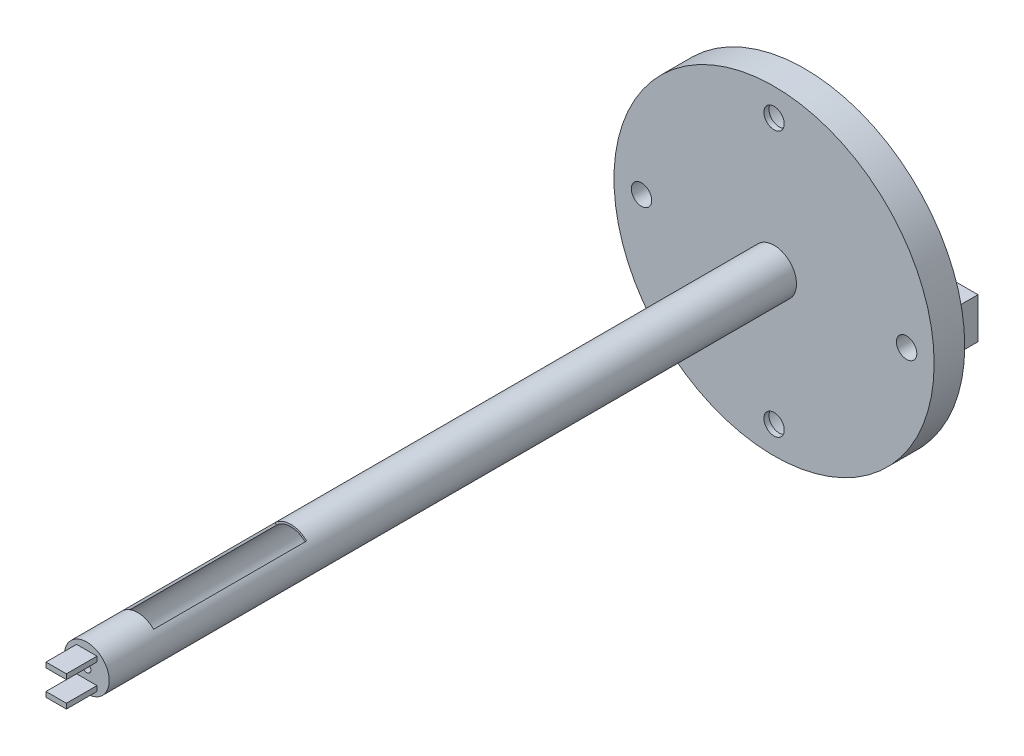
ISO-10303-21;
HEADER;
FILE_DESCRIPTION(('STEP AP214'),'2;1');
FILE_NAME('part.step','',(''),(''),'','','');
FILE_SCHEMA(('AUTOMOTIVE_DESIGN { 1 0 10303 214 1 1 1 1 }'));
ENDSEC;
DATA;
#1=APPLICATION_CONTEXT('core data for automotive mechanical design processes');
#2=APPLICATION_PROTOCOL_DEFINITION('international standard','automotive_design',2000,#1);
#3=PRODUCT_CONTEXT('',#1,'mechanical');
#4=PRODUCT('Part','Part','',(#3));
#5=PRODUCT_RELATED_PRODUCT_CATEGORY('part','',(#4));
#6=PRODUCT_DEFINITION_FORMATION('','',#4);
#7=PRODUCT_DEFINITION_CONTEXT('part definition',#1,'design');
#8=PRODUCT_DEFINITION('design','',#6,#7);
#9=PRODUCT_DEFINITION_SHAPE('','',#8);
#10=(LENGTH_UNIT() NAMED_UNIT(*) SI_UNIT(.MILLI.,.METRE.));
#11=(NAMED_UNIT(*) PLANE_ANGLE_UNIT() SI_UNIT($,.RADIAN.));
#12=(NAMED_UNIT(*) SI_UNIT($,.STERADIAN.) SOLID_ANGLE_UNIT());
#13=UNCERTAINTY_MEASURE_WITH_UNIT(LENGTH_MEASURE(1.E-05),#10,'distance_accuracy_value','');
#14=(GEOMETRIC_REPRESENTATION_CONTEXT(3) GLOBAL_UNCERTAINTY_ASSIGNED_CONTEXT((#13)) GLOBAL_UNIT_ASSIGNED_CONTEXT((#10,
#11,#12)) REPRESENTATION_CONTEXT('',''));
#15=CARTESIAN_POINT('',(0.,0.,0.));
#16=DIRECTION('',(0.,0.,1.));
#17=DIRECTION('',(1.,0.,0.));
#18=AXIS2_PLACEMENT_3D('',#15,#16,#17);
#19=CARTESIAN_POINT('',(-2.,2.,-3.));
#20=DIRECTION('',(0.,-1.,0.));
#21=DIRECTION('',(0.,0.,-1.));
#22=AXIS2_PLACEMENT_3D('',#19,#20,#21);
#23=PLANE('',#22);
#24=DIRECTION('',(1.,0.,0.));
#25=VECTOR('',#24,1.);
#26=CARTESIAN_POINT('',(-2.,2.,0.));
#27=LINE('',#26,#25);
#28=CARTESIAN_POINT('',(-14.,2.,0.));
#29=VERTEX_POINT('',#28);
#30=CARTESIAN_POINT('',(-2.,2.,0.));
#31=VERTEX_POINT('',#30);
#32=EDGE_CURVE('E111',#29,#31,#27,.T.);
#33=ORIENTED_EDGE('',*,*,#32,.T.);
#34=DIRECTION('',(0.,0.,1.));
#35=VECTOR('',#34,1.);
#36=CARTESIAN_POINT('',(-2.,2.,-3.));
#37=LINE('',#36,#35);
#38=CARTESIAN_POINT('',(-2.,2.,-3.));
#39=VERTEX_POINT('',#38);
#40=EDGE_CURVE('E13',#39,#31,#37,.T.);
#41=ORIENTED_EDGE('',*,*,#40,.F.);
#42=DIRECTION('',(1.,0.,0.));
#43=VECTOR('',#42,1.);
#44=CARTESIAN_POINT('',(-2.,2.,-3.));
#45=LINE('',#44,#43);
#46=CARTESIAN_POINT('',(-14.,2.,-3.));
#47=VERTEX_POINT('',#46);
#48=EDGE_CURVE('E98',#47,#39,#45,.T.);
#49=ORIENTED_EDGE('',*,*,#48,.F.);
#50=DIRECTION('',(0.,0.,1.));
#51=VECTOR('',#50,1.);
#52=CARTESIAN_POINT('',(-14.,2.,-3.));
#53=LINE('',#52,#51);
#54=EDGE_CURVE('E107',#47,#29,#53,.T.);
#55=ORIENTED_EDGE('',*,*,#54,.T.);
#56=EDGE_LOOP('',(#33,#41,#49,#55));
#57=FACE_BOUND('',#56,.T.);
#58=ADVANCED_FACE('F46',(#57),#23,.F.);
#59=CARTESIAN_POINT('',(-2.,2.,-3.));
#60=DIRECTION('',(-1.,0.,0.));
#61=DIRECTION('',(0.,-1.,0.));
#62=AXIS2_PLACEMENT_3D('',#59,#60,#61);
#63=PLANE('',#62);
#64=DIRECTION('',(0.,-1.,0.));
#65=VECTOR('',#64,1.);
#66=CARTESIAN_POINT('',(-2.,2.,0.));
#67=LINE('',#66,#65);
#68=CARTESIAN_POINT('',(-2.,-2.,0.));
#69=VERTEX_POINT('',#68);
#70=EDGE_CURVE('E102',#31,#69,#67,.T.);
#71=ORIENTED_EDGE('',*,*,#70,.T.);
#72=DIRECTION('',(0.,0.,1.));
#73=VECTOR('',#72,1.);
#74=CARTESIAN_POINT('',(-2.,-2.,-3.));
#75=LINE('',#74,#73);
#76=CARTESIAN_POINT('',(-2.,-2.,-3.));
#77=VERTEX_POINT('',#76);
#78=EDGE_CURVE('E55',#77,#69,#75,.T.);
#79=ORIENTED_EDGE('',*,*,#78,.F.);
#80=DIRECTION('',(0.,-1.,0.));
#81=VECTOR('',#80,1.);
#82=CARTESIAN_POINT('',(-2.,2.,-3.));
#83=LINE('',#82,#81);
#84=EDGE_CURVE('E93',#39,#77,#83,.T.);
#85=ORIENTED_EDGE('',*,*,#84,.F.);
#86=ORIENTED_EDGE('',*,*,#40,.T.);
#87=EDGE_LOOP('',(#71,#79,#85,#86));
#88=FACE_BOUND('',#87,.T.);
#89=ADVANCED_FACE('F101',(#88),#63,.F.);
#90=CARTESIAN_POINT('',(-2.,-2.,-3.));
#91=DIRECTION('',(0.,1.,0.));
#92=DIRECTION('',(-1.,0.,0.));
#93=AXIS2_PLACEMENT_3D('',#90,#91,#92);
#94=PLANE('',#93);
#95=DIRECTION('',(-1.,0.,0.));
#96=VECTOR('',#95,1.);
#97=CARTESIAN_POINT('',(-2.,-2.,0.));
#98=LINE('',#97,#96);
#99=CARTESIAN_POINT('',(-14.,-2.,0.));
#100=VERTEX_POINT('',#99);
#101=EDGE_CURVE('E80',#69,#100,#98,.T.);
#102=ORIENTED_EDGE('',*,*,#101,.T.);
#103=DIRECTION('',(0.,0.,1.));
#104=VECTOR('',#103,1.);
#105=CARTESIAN_POINT('',(-14.,-2.,-3.));
#106=LINE('',#105,#104);
#107=CARTESIAN_POINT('',(-14.,-2.,-3.));
#108=VERTEX_POINT('',#107);
#109=EDGE_CURVE('E103',#108,#100,#106,.T.);
#110=ORIENTED_EDGE('',*,*,#109,.F.);
#111=DIRECTION('',(-1.,0.,0.));
#112=VECTOR('',#111,1.);
#113=CARTESIAN_POINT('',(-2.,-2.,-3.));
#114=LINE('',#113,#112);
#115=EDGE_CURVE('E96',#77,#108,#114,.T.);
#116=ORIENTED_EDGE('',*,*,#115,.F.);
#117=ORIENTED_EDGE('',*,*,#78,.T.);
#118=EDGE_LOOP('',(#102,#110,#116,#117));
#119=FACE_BOUND('',#118,.T.);
#120=ADVANCED_FACE('F105',(#119),#94,.F.);
#121=CARTESIAN_POINT('',(-14.,2.,-3.));
#122=DIRECTION('',(1.,0.,0.));
#123=DIRECTION('',(0.,0.,-1.));
#124=AXIS2_PLACEMENT_3D('',#121,#122,#123);
#125=PLANE('',#124);
#126=DIRECTION('',(0.,1.,0.));
#127=VECTOR('',#126,1.);
#128=CARTESIAN_POINT('',(-14.,2.,0.));
#129=LINE('',#128,#127);
#130=EDGE_CURVE('E86',#100,#29,#129,.T.);
#131=ORIENTED_EDGE('',*,*,#130,.T.);
#132=ORIENTED_EDGE('',*,*,#54,.F.);
#133=DIRECTION('',(0.,1.,0.));
#134=VECTOR('',#133,1.);
#135=CARTESIAN_POINT('',(-14.,2.,-3.));
#136=LINE('',#135,#134);
#137=EDGE_CURVE('E63',#108,#47,#136,.T.);
#138=ORIENTED_EDGE('',*,*,#137,.F.);
#139=ORIENTED_EDGE('',*,*,#109,.T.);
#140=EDGE_LOOP('',(#131,#132,#138,#139));
#141=FACE_BOUND('',#140,.T.);
#142=ADVANCED_FACE('F118',(#141),#125,.F.);
#143=CARTESIAN_POINT('',(0.,0.,-3.));
#144=DIRECTION('',(0.,0.,1.));
#145=DIRECTION('',(1.,0.,0.));
#146=AXIS2_PLACEMENT_3D('',#143,#144,#145);
#147=PLANE('',#146);
#148=CARTESIAN_POINT('',(-8.,0.,-3.));
#149=DIRECTION('',(0.,0.,-1.));
#150=DIRECTION('',(-1.,0.,0.));
#151=AXIS2_PLACEMENT_3D('',#148,#149,#150);
#152=CIRCLE('',#151,1.);
#153=CARTESIAN_POINT('',(-9.,0.,-3.));
#154=VERTEX_POINT('',#153);
#155=EDGE_CURVE('E124',#154,#154,#152,.T.);
#156=ORIENTED_EDGE('',*,*,#155,.F.);
#157=EDGE_LOOP('',(#156));
#158=FACE_BOUND('',#157,.T.);
#159=ORIENTED_EDGE('',*,*,#48,.T.);
#160=ORIENTED_EDGE('',*,*,#84,.T.);
#161=ORIENTED_EDGE('',*,*,#115,.T.);
#162=ORIENTED_EDGE('',*,*,#137,.T.);
#163=EDGE_LOOP('',(#159,#160,#161,#162));
#164=FACE_BOUND('',#163,.T.);
#165=ADVANCED_FACE('F94',(#158,#164),#147,.F.);
#166=CARTESIAN_POINT('',(0.,0.,0.));
#167=DIRECTION('',(0.,0.,1.));
#168=DIRECTION('',(1.,0.,0.));
#169=AXIS2_PLACEMENT_3D('',#166,#167,#168);
#170=PLANE('',#169);
#171=CARTESIAN_POINT('',(-8.,0.,0.));
#172=DIRECTION('',(0.,0.,1.));
#173=DIRECTION('',(1.,0.,0.));
#174=AXIS2_PLACEMENT_3D('',#171,#172,#173);
#175=CIRCLE('',#174,1.);
#176=CARTESIAN_POINT('',(-7.,0.,0.));
#177=VERTEX_POINT('',#176);
#178=EDGE_CURVE('E49',#177,#177,#175,.T.);
#179=ORIENTED_EDGE('',*,*,#178,.F.);
#180=EDGE_LOOP('',(#179));
#181=FACE_BOUND('',#180,.T.);
#182=ORIENTED_EDGE('',*,*,#32,.F.);
#183=ORIENTED_EDGE('',*,*,#130,.F.);
#184=ORIENTED_EDGE('',*,*,#101,.F.);
#185=ORIENTED_EDGE('',*,*,#70,.F.);
#186=EDGE_LOOP('',(#182,#183,#184,#185));
#187=FACE_BOUND('',#186,.T.);
#188=ADVANCED_FACE('F121',(#181,#187),#170,.T.);
#189=CARTESIAN_POINT('',(-8.,0.,2.));
#190=DIRECTION('',(0.,0.,-1.));
#191=DIRECTION('',(-1.,0.,0.));
#192=AXIS2_PLACEMENT_3D('',#189,#190,#191);
#193=CYLINDRICAL_SURFACE('',#192,1.);
#194=ORIENTED_EDGE('',*,*,#178,.T.);
#195=EDGE_LOOP('',(#194));
#196=FACE_BOUND('',#195,.T.);
#197=ORIENTED_EDGE('',*,*,#155,.T.);
#198=EDGE_LOOP('',(#197));
#199=FACE_BOUND('',#198,.T.);
#200=ADVANCED_FACE('F131',(#196,#199),#193,.F.);
#201=CLOSED_SHELL('',(#58,#89,#120,#142,#165,#188,#200));
#202=MANIFOLD_SOLID_BREP('B2',#201);
#203=CARTESIAN_POINT('',(2.,2.,-3.));
#204=DIRECTION('',(0.,-1.,0.));
#205=DIRECTION('',(0.,0.,-1.));
#206=AXIS2_PLACEMENT_3D('',#203,#204,#205);
#207=PLANE('',#206);
#208=DIRECTION('',(1.,0.,0.));
#209=VECTOR('',#208,1.);
#210=CARTESIAN_POINT('',(2.,2.,0.));
#211=LINE('',#210,#209);
#212=CARTESIAN_POINT('',(2.,2.,0.));
#213=VERTEX_POINT('',#212);
#214=CARTESIAN_POINT('',(14.,2.,0.));
#215=VERTEX_POINT('',#214);
#216=EDGE_CURVE('E264',#213,#215,#211,.T.);
#217=ORIENTED_EDGE('',*,*,#216,.T.);
#218=DIRECTION('',(0.,0.,1.));
#219=VECTOR('',#218,1.);
#220=CARTESIAN_POINT('',(14.,2.,-3.));
#221=LINE('',#220,#219);
#222=CARTESIAN_POINT('',(14.,2.,-3.));
#223=VERTEX_POINT('',#222);
#224=EDGE_CURVE('E44',#223,#215,#221,.T.);
#225=ORIENTED_EDGE('',*,*,#224,.F.);
#226=DIRECTION('',(1.,0.,0.));
#227=VECTOR('',#226,1.);
#228=CARTESIAN_POINT('',(2.,2.,-3.));
#229=LINE('',#228,#227);
#230=CARTESIAN_POINT('',(2.,2.,-3.));
#231=VERTEX_POINT('',#230);
#232=EDGE_CURVE('E251',#231,#223,#229,.T.);
#233=ORIENTED_EDGE('',*,*,#232,.F.);
#234=DIRECTION('',(0.,0.,1.));
#235=VECTOR('',#234,1.);
#236=CARTESIAN_POINT('',(2.,2.,-3.));
#237=LINE('',#236,#235);
#238=EDGE_CURVE('E260',#231,#213,#237,.T.);
#239=ORIENTED_EDGE('',*,*,#238,.T.);
#240=EDGE_LOOP('',(#217,#225,#233,#239));
#241=FACE_BOUND('',#240,.T.);
#242=ADVANCED_FACE('F199',(#241),#207,.F.);
#243=CARTESIAN_POINT('',(14.,2.,-3.));
#244=DIRECTION('',(-1.,0.,0.));
#245=DIRECTION('',(0.,0.,1.));
#246=AXIS2_PLACEMENT_3D('',#243,#244,#245);
#247=PLANE('',#246);
#248=DIRECTION('',(0.,-1.,0.));
#249=VECTOR('',#248,1.);
#250=CARTESIAN_POINT('',(14.,2.,0.));
#251=LINE('',#250,#249);
#252=CARTESIAN_POINT('',(14.,-2.,0.));
#253=VERTEX_POINT('',#252);
#254=EDGE_CURVE('E255',#215,#253,#251,.T.);
#255=ORIENTED_EDGE('',*,*,#254,.T.);
#256=DIRECTION('',(0.,0.,1.));
#257=VECTOR('',#256,1.);
#258=CARTESIAN_POINT('',(14.,-2.,-3.));
#259=LINE('',#258,#257);
#260=CARTESIAN_POINT('',(14.,-2.,-3.));
#261=VERTEX_POINT('',#260);
#262=EDGE_CURVE('E208',#261,#253,#259,.T.);
#263=ORIENTED_EDGE('',*,*,#262,.F.);
#264=DIRECTION('',(0.,-1.,0.));
#265=VECTOR('',#264,1.);
#266=CARTESIAN_POINT('',(14.,2.,-3.));
#267=LINE('',#266,#265);
#268=EDGE_CURVE('E246',#223,#261,#267,.T.);
#269=ORIENTED_EDGE('',*,*,#268,.F.);
#270=ORIENTED_EDGE('',*,*,#224,.T.);
#271=EDGE_LOOP('',(#255,#263,#269,#270));
#272=FACE_BOUND('',#271,.T.);
#273=ADVANCED_FACE('F254',(#272),#247,.F.);
#274=CARTESIAN_POINT('',(2.,-2.,-3.));
#275=DIRECTION('',(0.,1.,0.));
#276=DIRECTION('',(-1.,0.,0.));
#277=AXIS2_PLACEMENT_3D('',#274,#275,#276);
#278=PLANE('',#277);
#279=DIRECTION('',(-1.,0.,0.));
#280=VECTOR('',#279,1.);
#281=CARTESIAN_POINT('',(2.,-2.,0.));
#282=LINE('',#281,#280);
#283=CARTESIAN_POINT('',(2.,-2.,0.));
#284=VERTEX_POINT('',#283);
#285=EDGE_CURVE('E233',#253,#284,#282,.T.);
#286=ORIENTED_EDGE('',*,*,#285,.T.);
#287=DIRECTION('',(0.,0.,1.));
#288=VECTOR('',#287,1.);
#289=CARTESIAN_POINT('',(2.,-2.,-3.));
#290=LINE('',#289,#288);
#291=CARTESIAN_POINT('',(2.,-2.,-3.));
#292=VERTEX_POINT('',#291);
#293=EDGE_CURVE('E256',#292,#284,#290,.T.);
#294=ORIENTED_EDGE('',*,*,#293,.F.);
#295=DIRECTION('',(-1.,0.,0.));
#296=VECTOR('',#295,1.);
#297=CARTESIAN_POINT('',(2.,-2.,-3.));
#298=LINE('',#297,#296);
#299=EDGE_CURVE('E249',#261,#292,#298,.T.);
#300=ORIENTED_EDGE('',*,*,#299,.F.);
#301=ORIENTED_EDGE('',*,*,#262,.T.);
#302=EDGE_LOOP('',(#286,#294,#300,#301));
#303=FACE_BOUND('',#302,.T.);
#304=ADVANCED_FACE('F258',(#303),#278,.F.);
#305=CARTESIAN_POINT('',(2.,2.,-3.));
#306=DIRECTION('',(1.,0.,0.));
#307=DIRECTION('',(0.,1.,0.));
#308=AXIS2_PLACEMENT_3D('',#305,#306,#307);
#309=PLANE('',#308);
#310=DIRECTION('',(0.,1.,0.));
#311=VECTOR('',#310,1.);
#312=CARTESIAN_POINT('',(2.,2.,0.));
#313=LINE('',#312,#311);
#314=EDGE_CURVE('E239',#284,#213,#313,.T.);
#315=ORIENTED_EDGE('',*,*,#314,.T.);
#316=ORIENTED_EDGE('',*,*,#238,.F.);
#317=DIRECTION('',(0.,1.,0.));
#318=VECTOR('',#317,1.);
#319=CARTESIAN_POINT('',(2.,2.,-3.));
#320=LINE('',#319,#318);
#321=EDGE_CURVE('E216',#292,#231,#320,.T.);
#322=ORIENTED_EDGE('',*,*,#321,.F.);
#323=ORIENTED_EDGE('',*,*,#293,.T.);
#324=EDGE_LOOP('',(#315,#316,#322,#323));
#325=FACE_BOUND('',#324,.T.);
#326=ADVANCED_FACE('F271',(#325),#309,.F.);
#327=CARTESIAN_POINT('',(0.,0.,-3.));
#328=DIRECTION('',(0.,0.,-1.));
#329=DIRECTION('',(-1.,0.,0.));
#330=AXIS2_PLACEMENT_3D('',#327,#328,#329);
#331=PLANE('',#330);
#332=CARTESIAN_POINT('',(8.,0.,-3.));
#333=DIRECTION('',(0.,0.,-1.));
#334=DIRECTION('',(-1.,0.,0.));
#335=AXIS2_PLACEMENT_3D('',#332,#333,#334);
#336=CIRCLE('',#335,1.);
#337=CARTESIAN_POINT('',(7.,0.,-3.));
#338=VERTEX_POINT('',#337);
#339=EDGE_CURVE('E277',#338,#338,#336,.T.);
#340=ORIENTED_EDGE('',*,*,#339,.F.);
#341=EDGE_LOOP('',(#340));
#342=FACE_BOUND('',#341,.T.);
#343=ORIENTED_EDGE('',*,*,#232,.T.);
#344=ORIENTED_EDGE('',*,*,#268,.T.);
#345=ORIENTED_EDGE('',*,*,#299,.T.);
#346=ORIENTED_EDGE('',*,*,#321,.T.);
#347=EDGE_LOOP('',(#343,#344,#345,#346));
#348=FACE_BOUND('',#347,.T.);
#349=ADVANCED_FACE('F247',(#342,#348),#331,.T.);
#350=CARTESIAN_POINT('',(0.,0.,0.));
#351=DIRECTION('',(0.,0.,-1.));
#352=DIRECTION('',(-1.,0.,0.));
#353=AXIS2_PLACEMENT_3D('',#350,#351,#352);
#354=PLANE('',#353);
#355=CARTESIAN_POINT('',(8.,0.,0.));
#356=DIRECTION('',(0.,0.,-1.));
#357=DIRECTION('',(-1.,0.,0.));
#358=AXIS2_PLACEMENT_3D('',#355,#356,#357);
#359=CIRCLE('',#358,1.);
#360=CARTESIAN_POINT('',(7.,0.,0.));
#361=VERTEX_POINT('',#360);
#362=EDGE_CURVE('E202',#361,#361,#359,.T.);
#363=ORIENTED_EDGE('',*,*,#362,.T.);
#364=EDGE_LOOP('',(#363));
#365=FACE_BOUND('',#364,.T.);
#366=ORIENTED_EDGE('',*,*,#216,.F.);
#367=ORIENTED_EDGE('',*,*,#314,.F.);
#368=ORIENTED_EDGE('',*,*,#285,.F.);
#369=ORIENTED_EDGE('',*,*,#254,.F.);
#370=EDGE_LOOP('',(#366,#367,#368,#369));
#371=FACE_BOUND('',#370,.T.);
#372=ADVANCED_FACE('F274',(#365,#371),#354,.F.);
#373=CARTESIAN_POINT('',(8.,0.,2.));
#374=DIRECTION('',(0.,0.,-1.));
#375=DIRECTION('',(-1.,0.,0.));
#376=AXIS2_PLACEMENT_3D('',#373,#374,#375);
#377=CYLINDRICAL_SURFACE('',#376,1.);
#378=ORIENTED_EDGE('',*,*,#339,.T.);
#379=EDGE_LOOP('',(#378));
#380=FACE_BOUND('',#379,.T.);
#381=ORIENTED_EDGE('',*,*,#362,.F.);
#382=EDGE_LOOP('',(#381));
#383=FACE_BOUND('',#382,.T.);
#384=ADVANCED_FACE('F285',(#380,#383),#377,.F.);
#385=CLOSED_SHELL('',(#242,#273,#304,#326,#349,#372,#384));
#386=MANIFOLD_SOLID_BREP('B7',#385);
#387=CARTESIAN_POINT('',(0.,0.,50.4));
#388=DIRECTION('',(0.,0.,-1.));
#389=DIRECTION('',(-1.,0.,0.));
#390=AXIS2_PLACEMENT_3D('',#387,#388,#389);
#391=CYLINDRICAL_SURFACE('',#390,2.2);
#392=CARTESIAN_POINT('',(0.,0.,3.));
#393=DIRECTION('',(0.,0.,1.));
#394=DIRECTION('',(1.,0.,0.));
#395=AXIS2_PLACEMENT_3D('',#392,#393,#394);
#396=CIRCLE('',#395,2.2);
#397=CARTESIAN_POINT('',(2.2,0.,3.));
#398=VERTEX_POINT('',#397);
#399=EDGE_CURVE('E540',#398,#398,#396,.T.);
#400=ORIENTED_EDGE('',*,*,#399,.T.);
#401=EDGE_LOOP('',(#400));
#402=FACE_BOUND('',#401,.T.);
#403=CARTESIAN_POINT('',(0.,0.,50.4));
#404=DIRECTION('',(0.,0.,1.));
#405=DIRECTION('',(1.,0.,0.));
#406=AXIS2_PLACEMENT_3D('',#403,#404,#405);
#407=CIRCLE('',#406,2.2);
#408=CARTESIAN_POINT('',(1.5556349186104,1.55563491861041,50.4));
#409=VERTEX_POINT('',#408);
#410=CARTESIAN_POINT('',(-1.55563491861041,1.5556349186104,50.4));
#411=VERTEX_POINT('',#410);
#412=EDGE_CURVE('E541',#409,#411,#407,.T.);
#413=ORIENTED_EDGE('',*,*,#412,.F.);
#414=DIRECTION('',(0.,0.,-1.));
#415=VECTOR('',#414,1.);
#416=CARTESIAN_POINT('',(1.5556349186104,1.55563491861041,65.4));
#417=LINE('',#416,#415);
#418=CARTESIAN_POINT('',(1.5556349186104,1.55563491861041,65.4));
#419=VERTEX_POINT('',#418);
#420=EDGE_CURVE('E535',#419,#409,#417,.T.);
#421=ORIENTED_EDGE('',*,*,#420,.F.);
#422=CARTESIAN_POINT('',(0.,0.,65.4));
#423=DIRECTION('',(0.,0.,1.));
#424=DIRECTION('',(1.,0.,0.));
#425=AXIS2_PLACEMENT_3D('',#422,#423,#424);
#426=CIRCLE('',#425,2.2);
#427=CARTESIAN_POINT('',(-1.55563491861041,1.5556349186104,65.4));
#428=VERTEX_POINT('',#427);
#429=EDGE_CURVE('E511',#419,#428,#426,.T.);
#430=ORIENTED_EDGE('',*,*,#429,.T.);
#431=DIRECTION('',(0.,0.,-1.));
#432=VECTOR('',#431,1.);
#433=CARTESIAN_POINT('',(-1.55563491861041,1.5556349186104,65.4));
#434=LINE('',#433,#432);
#435=EDGE_CURVE('E525',#428,#411,#434,.T.);
#436=ORIENTED_EDGE('',*,*,#435,.T.);
#437=EDGE_LOOP('',(#413,#421,#430,#436));
#438=FACE_BOUND('',#437,.T.);
#439=CARTESIAN_POINT('',(0.,0.,70.4));
#440=DIRECTION('',(0.,0.,1.));
#441=DIRECTION('',(1.,0.,0.));
#442=AXIS2_PLACEMENT_3D('',#439,#440,#441);
#443=CIRCLE('',#442,2.2);
#444=CARTESIAN_POINT('',(2.2,0.,70.4));
#445=VERTEX_POINT('',#444);
#446=EDGE_CURVE('E505',#445,#445,#443,.T.);
#447=ORIENTED_EDGE('',*,*,#446,.F.);
#448=EDGE_LOOP('',(#447));
#449=FACE_BOUND('',#448,.T.);
#450=ADVANCED_FACE('F343',(#402,#438,#449),#391,.T.);
#451=CARTESIAN_POINT('',(0.,0.,3.));
#452=DIRECTION('',(0.,0.,-1.));
#453=DIRECTION('',(-1.,0.,0.));
#454=AXIS2_PLACEMENT_3D('',#451,#452,#453);
#455=CYLINDRICAL_SURFACE('',#454,15.7);
#456=CARTESIAN_POINT('',(0.,0.,3.));
#457=DIRECTION('',(0.,0.,1.));
#458=DIRECTION('',(1.,0.,0.));
#459=AXIS2_PLACEMENT_3D('',#456,#457,#458);
#460=CIRCLE('',#459,15.7);
#461=CARTESIAN_POINT('',(15.7,0.,3.));
#462=VERTEX_POINT('',#461);
#463=EDGE_CURVE('E197',#462,#462,#460,.T.);
#464=ORIENTED_EDGE('',*,*,#463,.F.);
#465=EDGE_LOOP('',(#464));
#466=FACE_BOUND('',#465,.T.);
#467=CARTESIAN_POINT('',(0.,0.,0.));
#468=DIRECTION('',(0.,0.,1.));
#469=DIRECTION('',(1.,0.,0.));
#470=AXIS2_PLACEMENT_3D('',#467,#468,#469);
#471=CIRCLE('',#470,15.7);
#472=CARTESIAN_POINT('',(15.7,0.,0.));
#473=VERTEX_POINT('',#472);
#474=EDGE_CURVE('E352',#473,#473,#471,.T.);
#475=ORIENTED_EDGE('',*,*,#474,.T.);
#476=EDGE_LOOP('',(#475));
#477=FACE_BOUND('',#476,.T.);
#478=ADVANCED_FACE('F345',(#466,#477),#455,.T.);
#479=CARTESIAN_POINT('',(0.,0.,3.));
#480=DIRECTION('',(0.,0.,1.));
#481=DIRECTION('',(1.,0.,0.));
#482=AXIS2_PLACEMENT_3D('',#479,#480,#481);
#483=PLANE('',#482);
#484=CARTESIAN_POINT('',(0.,13.,3.));
#485=DIRECTION('',(0.,0.,1.));
#486=DIRECTION('',(1.,0.,0.));
#487=AXIS2_PLACEMENT_3D('',#484,#485,#486);
#488=CIRCLE('',#487,1.);
#489=CARTESIAN_POINT('',(1.,13.,3.));
#490=VERTEX_POINT('',#489);
#491=EDGE_CURVE('E594',#490,#490,#488,.T.);
#492=ORIENTED_EDGE('',*,*,#491,.F.);
#493=EDGE_LOOP('',(#492));
#494=FACE_BOUND('',#493,.T.);
#495=CARTESIAN_POINT('',(0.,-13.,3.));
#496=DIRECTION('',(0.,0.,1.));
#497=DIRECTION('',(1.,0.,0.));
#498=AXIS2_PLACEMENT_3D('',#495,#496,#497);
#499=CIRCLE('',#498,1.);
#500=CARTESIAN_POINT('',(1.,-13.,3.));
#501=VERTEX_POINT('',#500);
#502=EDGE_CURVE('E597',#501,#501,#499,.T.);
#503=ORIENTED_EDGE('',*,*,#502,.F.);
#504=EDGE_LOOP('',(#503));
#505=FACE_BOUND('',#504,.T.);
#506=ORIENTED_EDGE('',*,*,#399,.F.);
#507=EDGE_LOOP('',(#506));
#508=FACE_BOUND('',#507,.T.);
#509=CARTESIAN_POINT('',(13.,0.,3.));
#510=DIRECTION('',(0.,0.,-1.));
#511=DIRECTION('',(-1.,0.,0.));
#512=AXIS2_PLACEMENT_3D('',#509,#510,#511);
#513=CIRCLE('',#512,1.);
#514=CARTESIAN_POINT('',(12.,0.,3.));
#515=VERTEX_POINT('',#514);
#516=EDGE_CURVE('E550',#515,#515,#513,.T.);
#517=ORIENTED_EDGE('',*,*,#516,.T.);
#518=EDGE_LOOP('',(#517));
#519=FACE_BOUND('',#518,.T.);
#520=CARTESIAN_POINT('',(-13.,0.,3.));
#521=DIRECTION('',(0.,0.,-1.));
#522=DIRECTION('',(-1.,0.,0.));
#523=AXIS2_PLACEMENT_3D('',#520,#521,#522);
#524=CIRCLE('',#523,1.);
#525=CARTESIAN_POINT('',(-14.,0.,3.));
#526=VERTEX_POINT('',#525);
#527=EDGE_CURVE('E556',#526,#526,#524,.T.);
#528=ORIENTED_EDGE('',*,*,#527,.T.);
#529=EDGE_LOOP('',(#528));
#530=FACE_BOUND('',#529,.T.);
#531=ORIENTED_EDGE('',*,*,#463,.T.);
#532=EDGE_LOOP('',(#531));
#533=FACE_BOUND('',#532,.T.);
#534=ADVANCED_FACE('F645',(#494,#505,#508,#519,#530,#533),#483,.T.);
#535=CARTESIAN_POINT('',(0.,0.,0.));
#536=DIRECTION('',(0.,0.,1.));
#537=DIRECTION('',(1.,0.,0.));
#538=AXIS2_PLACEMENT_3D('',#535,#536,#537);
#539=PLANE('',#538);
#540=CARTESIAN_POINT('',(-8.,0.,0.));
#541=DIRECTION('',(0.,0.,1.));
#542=DIRECTION('',(1.,0.,0.));
#543=AXIS2_PLACEMENT_3D('',#540,#541,#542);
#544=CIRCLE('',#543,1.);
#545=CARTESIAN_POINT('',(-7.,0.,0.));
#546=VERTEX_POINT('',#545);
#547=EDGE_CURVE('E347',#546,#546,#544,.T.);
#548=ORIENTED_EDGE('',*,*,#547,.T.);
#549=EDGE_LOOP('',(#548));
#550=FACE_BOUND('',#549,.T.);
#551=CARTESIAN_POINT('',(8.,0.,0.));
#552=DIRECTION('',(0.,0.,1.));
#553=DIRECTION('',(1.,0.,0.));
#554=AXIS2_PLACEMENT_3D('',#551,#552,#553);
#555=CIRCLE('',#554,1.);
#556=CARTESIAN_POINT('',(9.,0.,0.));
#557=VERTEX_POINT('',#556);
#558=EDGE_CURVE('E564',#557,#557,#555,.T.);
#559=ORIENTED_EDGE('',*,*,#558,.T.);
#560=EDGE_LOOP('',(#559));
#561=FACE_BOUND('',#560,.T.);
#562=CARTESIAN_POINT('',(0.,13.,0.));
#563=DIRECTION('',(0.,0.,1.));
#564=DIRECTION('',(1.,0.,0.));
#565=AXIS2_PLACEMENT_3D('',#562,#563,#564);
#566=CIRCLE('',#565,2.5);
#567=CARTESIAN_POINT('',(2.5,13.,0.));
#568=VERTEX_POINT('',#567);
#569=EDGE_CURVE('E579',#568,#568,#566,.T.);
#570=ORIENTED_EDGE('',*,*,#569,.T.);
#571=EDGE_LOOP('',(#570));
#572=FACE_BOUND('',#571,.T.);
#573=CARTESIAN_POINT('',(0.,-13.,0.));
#574=DIRECTION('',(0.,0.,1.));
#575=DIRECTION('',(1.,0.,0.));
#576=AXIS2_PLACEMENT_3D('',#573,#574,#575);
#577=CIRCLE('',#576,2.5);
#578=CARTESIAN_POINT('',(2.5,-13.,0.));
#579=VERTEX_POINT('',#578);
#580=EDGE_CURVE('E586',#579,#579,#577,.T.);
#581=ORIENTED_EDGE('',*,*,#580,.T.);
#582=EDGE_LOOP('',(#581));
#583=FACE_BOUND('',#582,.T.);
#584=CARTESIAN_POINT('',(0.,0.,0.));
#585=DIRECTION('',(0.,0.,-1.));
#586=DIRECTION('',(-1.,0.,0.));
#587=AXIS2_PLACEMENT_3D('',#584,#585,#586);
#588=CIRCLE('',#587,2.);
#589=CARTESIAN_POINT('',(-2.,0.,0.));
#590=VERTEX_POINT('',#589);
#591=EDGE_CURVE('E544',#590,#590,#588,.T.);
#592=ORIENTED_EDGE('',*,*,#591,.F.);
#593=EDGE_LOOP('',(#592));
#594=FACE_BOUND('',#593,.T.);
#595=CARTESIAN_POINT('',(13.,0.,0.));
#596=DIRECTION('',(0.,0.,-1.));
#597=DIRECTION('',(-1.,0.,0.));
#598=AXIS2_PLACEMENT_3D('',#595,#596,#597);
#599=CIRCLE('',#598,1.);
#600=CARTESIAN_POINT('',(12.,0.,0.));
#601=VERTEX_POINT('',#600);
#602=EDGE_CURVE('E549',#601,#601,#599,.T.);
#603=ORIENTED_EDGE('',*,*,#602,.F.);
#604=EDGE_LOOP('',(#603));
#605=FACE_BOUND('',#604,.T.);
#606=CARTESIAN_POINT('',(-13.,0.,0.));
#607=DIRECTION('',(0.,0.,-1.));
#608=DIRECTION('',(-1.,0.,0.));
#609=AXIS2_PLACEMENT_3D('',#606,#607,#608);
#610=CIRCLE('',#609,1.);
#611=CARTESIAN_POINT('',(-14.,0.,0.));
#612=VERTEX_POINT('',#611);
#613=EDGE_CURVE('E553',#612,#612,#610,.T.);
#614=ORIENTED_EDGE('',*,*,#613,.F.);
#615=EDGE_LOOP('',(#614));
#616=FACE_BOUND('',#615,.T.);
#617=ORIENTED_EDGE('',*,*,#474,.F.);
#618=EDGE_LOOP('',(#617));
#619=FACE_BOUND('',#618,.T.);
#620=ADVANCED_FACE('F663',(#550,#561,#572,#583,#594,#605,#616,#619),#539,.F.);
#621=CARTESIAN_POINT('',(-13.,0.,3.));
#622=DIRECTION('',(0.,0.,-1.));
#623=DIRECTION('',(-1.,0.,0.));
#624=AXIS2_PLACEMENT_3D('',#621,#622,#623);
#625=CYLINDRICAL_SURFACE('',#624,1.);
#626=ORIENTED_EDGE('',*,*,#527,.F.);
#627=EDGE_LOOP('',(#626));
#628=FACE_BOUND('',#627,.T.);
#629=ORIENTED_EDGE('',*,*,#613,.T.);
#630=EDGE_LOOP('',(#629));
#631=FACE_BOUND('',#630,.T.);
#632=ADVANCED_FACE('F659',(#628,#631),#625,.F.);
#633=CARTESIAN_POINT('',(13.,0.,3.));
#634=DIRECTION('',(0.,0.,-1.));
#635=DIRECTION('',(-1.,0.,0.));
#636=AXIS2_PLACEMENT_3D('',#633,#634,#635);
#637=CYLINDRICAL_SURFACE('',#636,1.);
#638=ORIENTED_EDGE('',*,*,#516,.F.);
#639=EDGE_LOOP('',(#638));
#640=FACE_BOUND('',#639,.T.);
#641=ORIENTED_EDGE('',*,*,#602,.T.);
#642=EDGE_LOOP('',(#641));
#643=FACE_BOUND('',#642,.T.);
#644=ADVANCED_FACE('F655',(#640,#643),#637,.F.);
#645=CARTESIAN_POINT('',(0.,0.,3.));
#646=DIRECTION('',(0.,0.,-1.));
#647=DIRECTION('',(-1.,0.,0.));
#648=AXIS2_PLACEMENT_3D('',#645,#646,#647);
#649=CYLINDRICAL_SURFACE('',#648,2.);
#650=ORIENTED_EDGE('',*,*,#591,.T.);
#651=EDGE_LOOP('',(#650));
#652=FACE_BOUND('',#651,.T.);
#653=CARTESIAN_POINT('',(0.,0.,50.4));
#654=DIRECTION('',(0.,0.,-1.));
#655=DIRECTION('',(-1.,0.,0.));
#656=AXIS2_PLACEMENT_3D('',#653,#654,#655);
#657=CIRCLE('',#656,2.);
#658=CARTESIAN_POINT('',(-1.4142135623731,1.41421356237309,50.4));
#659=VERTEX_POINT('',#658);
#660=CARTESIAN_POINT('',(1.41421356237309,1.4142135623731,50.4));
#661=VERTEX_POINT('',#660);
#662=EDGE_CURVE('E537',#659,#661,#657,.T.);
#663=ORIENTED_EDGE('',*,*,#662,.F.);
#664=DIRECTION('',(0.,0.,-1.));
#665=VECTOR('',#664,1.);
#666=CARTESIAN_POINT('',(-1.4142135623731,1.41421356237309,65.4));
#667=LINE('',#666,#665);
#668=CARTESIAN_POINT('',(-1.4142135623731,1.41421356237309,65.4));
#669=VERTEX_POINT('',#668);
#670=EDGE_CURVE('E531',#669,#659,#667,.T.);
#671=ORIENTED_EDGE('',*,*,#670,.F.);
#672=CARTESIAN_POINT('',(0.,0.,65.4));
#673=DIRECTION('',(0.,0.,1.));
#674=DIRECTION('',(1.,0.,0.));
#675=AXIS2_PLACEMENT_3D('',#672,#673,#674);
#676=CIRCLE('',#675,2.);
#677=CARTESIAN_POINT('',(1.41421356237309,1.4142135623731,65.4));
#678=VERTEX_POINT('',#677);
#679=EDGE_CURVE('E518',#678,#669,#676,.F.);
#680=ORIENTED_EDGE('',*,*,#679,.F.);
#681=DIRECTION('',(0.,0.,-1.));
#682=VECTOR('',#681,1.);
#683=CARTESIAN_POINT('',(1.41421356237309,1.4142135623731,65.4));
#684=LINE('',#683,#682);
#685=EDGE_CURVE('E533',#678,#661,#684,.T.);
#686=ORIENTED_EDGE('',*,*,#685,.T.);
#687=EDGE_LOOP('',(#663,#671,#680,#686));
#688=FACE_BOUND('',#687,.T.);
#689=ADVANCED_FACE('F652',(#652,#688),#649,.F.);
#690=CARTESIAN_POINT('',(0.,0.,50.4));
#691=DIRECTION('',(0.,0.,1.));
#692=DIRECTION('',(1.,0.,0.));
#693=AXIS2_PLACEMENT_3D('',#690,#691,#692);
#694=PLANE('',#693);
#695=DIRECTION('',(-0.707106781186551,0.707106781186544,0.));
#696=VECTOR('',#695,1.);
#697=CARTESIAN_POINT('',(0.,0.,50.4));
#698=LINE('',#697,#696);
#699=EDGE_CURVE('E519',#659,#411,#698,.T.);
#700=ORIENTED_EDGE('',*,*,#699,.F.);
#701=ORIENTED_EDGE('',*,*,#662,.T.);
#702=DIRECTION('',(0.707106781186546,0.707106781186549,0.));
#703=VECTOR('',#702,1.);
#704=CARTESIAN_POINT('',(0.,0.,50.4));
#705=LINE('',#704,#703);
#706=EDGE_CURVE('E514',#661,#409,#705,.T.);
#707=ORIENTED_EDGE('',*,*,#706,.T.);
#708=ORIENTED_EDGE('',*,*,#412,.T.);
#709=EDGE_LOOP('',(#700,#701,#707,#708));
#710=FACE_BOUND('',#709,.T.);
#711=ADVANCED_FACE('F650',(#710),#694,.T.);
#712=CARTESIAN_POINT('',(0.,0.,65.4));
#713=DIRECTION('',(-0.707106781186549,0.707106781186546,0.));
#714=DIRECTION('',(-0.707106781186546,-0.707106781186549,0.));
#715=AXIS2_PLACEMENT_3D('',#712,#713,#714);
#716=PLANE('',#715);
#717=ORIENTED_EDGE('',*,*,#706,.F.);
#718=ORIENTED_EDGE('',*,*,#685,.F.);
#719=DIRECTION('',(0.707106781186546,0.707106781186549,0.));
#720=VECTOR('',#719,1.);
#721=CARTESIAN_POINT('',(0.,0.,65.4));
#722=LINE('',#721,#720);
#723=EDGE_CURVE('E515',#678,#419,#722,.T.);
#724=ORIENTED_EDGE('',*,*,#723,.T.);
#725=ORIENTED_EDGE('',*,*,#420,.T.);
#726=EDGE_LOOP('',(#717,#718,#724,#725));
#727=FACE_BOUND('',#726,.T.);
#728=ADVANCED_FACE('F702',(#727),#716,.T.);
#729=CARTESIAN_POINT('',(0.,0.,65.4));
#730=DIRECTION('',(-0.707106781186544,-0.707106781186551,0.));
#731=DIRECTION('',(0.707106781186551,-0.707106781186544,0.));
#732=AXIS2_PLACEMENT_3D('',#729,#730,#731);
#733=PLANE('',#732);
#734=ORIENTED_EDGE('',*,*,#699,.T.);
#735=ORIENTED_EDGE('',*,*,#435,.F.);
#736=DIRECTION('',(-0.707106781186551,0.707106781186544,0.));
#737=VECTOR('',#736,1.);
#738=CARTESIAN_POINT('',(0.,0.,65.4));
#739=LINE('',#738,#737);
#740=EDGE_CURVE('E522',#669,#428,#739,.T.);
#741=ORIENTED_EDGE('',*,*,#740,.F.);
#742=ORIENTED_EDGE('',*,*,#670,.T.);
#743=EDGE_LOOP('',(#734,#735,#741,#742));
#744=FACE_BOUND('',#743,.T.);
#745=ADVANCED_FACE('F696',(#744),#733,.F.);
#746=CARTESIAN_POINT('',(0.,0.,65.4));
#747=DIRECTION('',(0.,0.,1.));
#748=DIRECTION('',(1.,0.,0.));
#749=AXIS2_PLACEMENT_3D('',#746,#747,#748);
#750=PLANE('',#749);
#751=CARTESIAN_POINT('',(0.,0.,65.4));
#752=DIRECTION('',(0.,0.,1.));
#753=DIRECTION('',(1.,0.,0.));
#754=AXIS2_PLACEMENT_3D('',#751,#752,#753);
#755=CIRCLE('',#754,0.4);
#756=CARTESIAN_POINT('',(0.4,0.,65.4));
#757=VERTEX_POINT('',#756);
#758=EDGE_CURVE('E473',#757,#757,#755,.T.);
#759=ORIENTED_EDGE('',*,*,#758,.T.);
#760=EDGE_LOOP('',(#759));
#761=FACE_BOUND('',#760,.T.);
#762=ORIENTED_EDGE('',*,*,#723,.F.);
#763=ORIENTED_EDGE('',*,*,#679,.T.);
#764=ORIENTED_EDGE('',*,*,#740,.T.);
#765=ORIENTED_EDGE('',*,*,#429,.F.);
#766=EDGE_LOOP('',(#762,#763,#764,#765));
#767=FACE_BOUND('',#766,.T.);
#768=ADVANCED_FACE('F612',(#761,#767),#750,.F.);
#769=CARTESIAN_POINT('',(0.,0.,70.4));
#770=DIRECTION('',(0.,0.,1.));
#771=DIRECTION('',(1.,0.,0.));
#772=AXIS2_PLACEMENT_3D('',#769,#770,#771);
#773=PLANE('',#772);
#774=CARTESIAN_POINT('',(0.,0.,70.4));
#775=DIRECTION('',(0.,0.,1.));
#776=DIRECTION('',(1.,0.,0.));
#777=AXIS2_PLACEMENT_3D('',#774,#775,#776);
#778=CIRCLE('',#777,0.4);
#779=CARTESIAN_POINT('',(0.4,0.,70.4));
#780=VERTEX_POINT('',#779);
#781=EDGE_CURVE('E466',#780,#780,#778,.T.);
#782=ORIENTED_EDGE('',*,*,#781,.F.);
#783=EDGE_LOOP('',(#782));
#784=FACE_BOUND('',#783,.T.);
#785=DIRECTION('',(1.,0.,0.));
#786=VECTOR('',#785,1.);
#787=CARTESIAN_POINT('',(1.,1.,70.4));
#788=LINE('',#787,#786);
#789=CARTESIAN_POINT('',(-1.,1.,70.4));
#790=VERTEX_POINT('',#789);
#791=CARTESIAN_POINT('',(1.,1.,70.4));
#792=VERTEX_POINT('',#791);
#793=EDGE_CURVE('E491',#790,#792,#788,.T.);
#794=ORIENTED_EDGE('',*,*,#793,.F.);
#795=DIRECTION('',(0.,-1.,0.));
#796=VECTOR('',#795,1.);
#797=CARTESIAN_POINT('',(-1.,1.5,70.4));
#798=LINE('',#797,#796);
#799=CARTESIAN_POINT('',(-1.,1.5,70.4));
#800=VERTEX_POINT('',#799);
#801=EDGE_CURVE('E488',#800,#790,#798,.T.);
#802=ORIENTED_EDGE('',*,*,#801,.F.);
#803=DIRECTION('',(-1.,0.,0.));
#804=VECTOR('',#803,1.);
#805=CARTESIAN_POINT('',(1.,1.5,70.4));
#806=LINE('',#805,#804);
#807=CARTESIAN_POINT('',(1.,1.5,70.4));
#808=VERTEX_POINT('',#807);
#809=EDGE_CURVE('E484',#808,#800,#806,.T.);
#810=ORIENTED_EDGE('',*,*,#809,.F.);
#811=DIRECTION('',(0.,1.,0.));
#812=VECTOR('',#811,1.);
#813=CARTESIAN_POINT('',(1.,1.5,70.4));
#814=LINE('',#813,#812);
#815=EDGE_CURVE('E481',#792,#808,#814,.T.);
#816=ORIENTED_EDGE('',*,*,#815,.F.);
#817=EDGE_LOOP('',(#794,#802,#810,#816));
#818=FACE_BOUND('',#817,.T.);
#819=DIRECTION('',(1.,0.,0.));
#820=VECTOR('',#819,1.);
#821=CARTESIAN_POINT('',(1.,-1.5,70.4));
#822=LINE('',#821,#820);
#823=CARTESIAN_POINT('',(-1.,-1.5,70.4));
#824=VERTEX_POINT('',#823);
#825=CARTESIAN_POINT('',(1.,-1.5,70.4));
#826=VERTEX_POINT('',#825);
#827=EDGE_CURVE('E447',#824,#826,#822,.T.);
#828=ORIENTED_EDGE('',*,*,#827,.F.);
#829=DIRECTION('',(0.,-1.,0.));
#830=VECTOR('',#829,1.);
#831=CARTESIAN_POINT('',(-1.,-1.,70.4));
#832=LINE('',#831,#830);
#833=CARTESIAN_POINT('',(-1.,-1.,70.4));
#834=VERTEX_POINT('',#833);
#835=EDGE_CURVE('E457',#834,#824,#832,.T.);
#836=ORIENTED_EDGE('',*,*,#835,.F.);
#837=DIRECTION('',(-1.,0.,0.));
#838=VECTOR('',#837,1.);
#839=CARTESIAN_POINT('',(1.,-1.,70.4));
#840=LINE('',#839,#838);
#841=CARTESIAN_POINT('',(1.,-1.,70.4));
#842=VERTEX_POINT('',#841);
#843=EDGE_CURVE('E439',#842,#834,#840,.T.);
#844=ORIENTED_EDGE('',*,*,#843,.F.);
#845=DIRECTION('',(0.,1.,0.));
#846=VECTOR('',#845,1.);
#847=CARTESIAN_POINT('',(1.,-1.,70.4));
#848=LINE('',#847,#846);
#849=EDGE_CURVE('E454',#826,#842,#848,.T.);
#850=ORIENTED_EDGE('',*,*,#849,.F.);
#851=EDGE_LOOP('',(#828,#836,#844,#850));
#852=FACE_BOUND('',#851,.T.);
#853=ORIENTED_EDGE('',*,*,#446,.T.);
#854=EDGE_LOOP('',(#853));
#855=FACE_BOUND('',#854,.T.);
#856=ADVANCED_FACE('F452',(#784,#818,#852,#855),#773,.T.);
#857=CARTESIAN_POINT('',(1.,1.5,70.4));
#858=DIRECTION('',(1.,0.,0.));
#859=DIRECTION('',(0.,0.,-1.));
#860=AXIS2_PLACEMENT_3D('',#857,#858,#859);
#861=PLANE('',#860);
#862=DIRECTION('',(0.,1.,0.));
#863=VECTOR('',#862,1.);
#864=CARTESIAN_POINT('',(1.,1.5,73.4));
#865=LINE('',#864,#863);
#866=CARTESIAN_POINT('',(1.,1.,73.4));
#867=VERTEX_POINT('',#866);
#868=CARTESIAN_POINT('',(1.,1.5,73.4));
#869=VERTEX_POINT('',#868);
#870=EDGE_CURVE('E477',#867,#869,#865,.T.);
#871=ORIENTED_EDGE('',*,*,#870,.F.);
#872=DIRECTION('',(0.,0.,1.));
#873=VECTOR('',#872,1.);
#874=CARTESIAN_POINT('',(1.,1.,70.4));
#875=LINE('',#874,#873);
#876=EDGE_CURVE('E503',#792,#867,#875,.T.);
#877=ORIENTED_EDGE('',*,*,#876,.F.);
#878=ORIENTED_EDGE('',*,*,#815,.T.);
#879=DIRECTION('',(0.,0.,1.));
#880=VECTOR('',#879,1.);
#881=CARTESIAN_POINT('',(1.,1.5,70.4));
#882=LINE('',#881,#880);
#883=EDGE_CURVE('E494',#808,#869,#882,.T.);
#884=ORIENTED_EDGE('',*,*,#883,.T.);
#885=EDGE_LOOP('',(#871,#877,#878,#884));
#886=FACE_BOUND('',#885,.T.);
#887=ADVANCED_FACE('F611',(#886),#861,.T.);
#888=CARTESIAN_POINT('',(1.,1.,70.4));
#889=DIRECTION('',(0.,-1.,0.));
#890=DIRECTION('',(0.,0.,-1.));
#891=AXIS2_PLACEMENT_3D('',#888,#889,#890);
#892=PLANE('',#891);
#893=DIRECTION('',(1.,0.,0.));
#894=VECTOR('',#893,1.);
#895=CARTESIAN_POINT('',(1.,1.,73.4));
#896=LINE('',#895,#894);
#897=CARTESIAN_POINT('',(-1.,1.,73.4));
#898=VERTEX_POINT('',#897);
#899=EDGE_CURVE('E485',#898,#867,#896,.T.);
#900=ORIENTED_EDGE('',*,*,#899,.F.);
#901=DIRECTION('',(0.,0.,1.));
#902=VECTOR('',#901,1.);
#903=CARTESIAN_POINT('',(-1.,1.,70.4));
#904=LINE('',#903,#902);
#905=EDGE_CURVE('E506',#790,#898,#904,.T.);
#906=ORIENTED_EDGE('',*,*,#905,.F.);
#907=ORIENTED_EDGE('',*,*,#793,.T.);
#908=ORIENTED_EDGE('',*,*,#876,.T.);
#909=EDGE_LOOP('',(#900,#906,#907,#908));
#910=FACE_BOUND('',#909,.T.);
#911=ADVANCED_FACE('F625',(#910),#892,.T.);
#912=CARTESIAN_POINT('',(-1.,1.5,70.4));
#913=DIRECTION('',(-1.,0.,0.));
#914=DIRECTION('',(0.,-1.,0.));
#915=AXIS2_PLACEMENT_3D('',#912,#913,#914);
#916=PLANE('',#915);
#917=DIRECTION('',(0.,-1.,0.));
#918=VECTOR('',#917,1.);
#919=CARTESIAN_POINT('',(-1.,1.5,73.4));
#920=LINE('',#919,#918);
#921=CARTESIAN_POINT('',(-1.,1.5,73.4));
#922=VERTEX_POINT('',#921);
#923=EDGE_CURVE('E360',#922,#898,#920,.T.);
#924=ORIENTED_EDGE('',*,*,#923,.F.);
#925=DIRECTION('',(0.,0.,1.));
#926=VECTOR('',#925,1.);
#927=CARTESIAN_POINT('',(-1.,1.5,70.4));
#928=LINE('',#927,#926);
#929=EDGE_CURVE('E508',#800,#922,#928,.T.);
#930=ORIENTED_EDGE('',*,*,#929,.F.);
#931=ORIENTED_EDGE('',*,*,#801,.T.);
#932=ORIENTED_EDGE('',*,*,#905,.T.);
#933=EDGE_LOOP('',(#924,#930,#931,#932));
#934=FACE_BOUND('',#933,.T.);
#935=ADVANCED_FACE('F618',(#934),#916,.T.);
#936=CARTESIAN_POINT('',(1.,1.5,70.4));
#937=DIRECTION('',(0.,1.,0.));
#938=DIRECTION('',(0.,0.,1.));
#939=AXIS2_PLACEMENT_3D('',#936,#937,#938);
#940=PLANE('',#939);
#941=DIRECTION('',(-1.,0.,0.));
#942=VECTOR('',#941,1.);
#943=CARTESIAN_POINT('',(1.,1.5,73.4));
#944=LINE('',#943,#942);
#945=EDGE_CURVE('E497',#869,#922,#944,.T.);
#946=ORIENTED_EDGE('',*,*,#945,.F.);
#947=ORIENTED_EDGE('',*,*,#883,.F.);
#948=ORIENTED_EDGE('',*,*,#809,.T.);
#949=ORIENTED_EDGE('',*,*,#929,.T.);
#950=EDGE_LOOP('',(#946,#947,#948,#949));
#951=FACE_BOUND('',#950,.T.);
#952=ADVANCED_FACE('F622',(#951),#940,.T.);
#953=CARTESIAN_POINT('',(1.,-1.,70.4));
#954=DIRECTION('',(1.,0.,0.));
#955=DIRECTION('',(0.,0.,-1.));
#956=AXIS2_PLACEMENT_3D('',#953,#954,#955);
#957=PLANE('',#956);
#958=DIRECTION('',(0.,1.,0.));
#959=VECTOR('',#958,1.);
#960=CARTESIAN_POINT('',(1.,-1.,73.4));
#961=LINE('',#960,#959);
#962=CARTESIAN_POINT('',(1.,-1.5,73.4));
#963=VERTEX_POINT('',#962);
#964=CARTESIAN_POINT('',(1.,-1.,73.4));
#965=VERTEX_POINT('',#964);
#966=EDGE_CURVE('E471',#963,#965,#961,.T.);
#967=ORIENTED_EDGE('',*,*,#966,.F.);
#968=DIRECTION('',(0.,0.,1.));
#969=VECTOR('',#968,1.);
#970=CARTESIAN_POINT('',(1.,-1.5,70.4));
#971=LINE('',#970,#969);
#972=EDGE_CURVE('E460',#826,#963,#971,.T.);
#973=ORIENTED_EDGE('',*,*,#972,.F.);
#974=ORIENTED_EDGE('',*,*,#849,.T.);
#975=DIRECTION('',(0.,0.,1.));
#976=VECTOR('',#975,1.);
#977=CARTESIAN_POINT('',(1.,-1.,70.4));
#978=LINE('',#977,#976);
#979=EDGE_CURVE('E436',#842,#965,#978,.T.);
#980=ORIENTED_EDGE('',*,*,#979,.T.);
#981=EDGE_LOOP('',(#967,#973,#974,#980));
#982=FACE_BOUND('',#981,.T.);
#983=ADVANCED_FACE('F459',(#982),#957,.T.);
#984=CARTESIAN_POINT('',(1.,-1.5,70.4));
#985=DIRECTION('',(0.,-1.,0.));
#986=DIRECTION('',(0.,0.,-1.));
#987=AXIS2_PLACEMENT_3D('',#984,#985,#986);
#988=PLANE('',#987);
#989=DIRECTION('',(1.,0.,0.));
#990=VECTOR('',#989,1.);
#991=CARTESIAN_POINT('',(1.,-1.5,73.4));
#992=LINE('',#991,#990);
#993=CARTESIAN_POINT('',(-1.,-1.5,73.4));
#994=VERTEX_POINT('',#993);
#995=EDGE_CURVE('E461',#994,#963,#992,.T.);
#996=ORIENTED_EDGE('',*,*,#995,.F.);
#997=DIRECTION('',(0.,0.,1.));
#998=VECTOR('',#997,1.);
#999=CARTESIAN_POINT('',(-1.,-1.5,70.4));
#1000=LINE('',#999,#998);
#1001=EDGE_CURVE('E478',#824,#994,#1000,.T.);
#1002=ORIENTED_EDGE('',*,*,#1001,.F.);
#1003=ORIENTED_EDGE('',*,*,#827,.T.);
#1004=ORIENTED_EDGE('',*,*,#972,.T.);
#1005=EDGE_LOOP('',(#996,#1002,#1003,#1004));
#1006=FACE_BOUND('',#1005,.T.);
#1007=ADVANCED_FACE('F750',(#1006),#988,.T.);
#1008=CARTESIAN_POINT('',(-1.,-1.,70.4));
#1009=DIRECTION('',(-1.,0.,0.));
#1010=DIRECTION('',(0.,0.,1.));
#1011=AXIS2_PLACEMENT_3D('',#1008,#1009,#1010);
#1012=PLANE('',#1011);
#1013=DIRECTION('',(0.,-1.,0.));
#1014=VECTOR('',#1013,1.);
#1015=CARTESIAN_POINT('',(-1.,-1.,73.4));
#1016=LINE('',#1015,#1014);
#1017=CARTESIAN_POINT('',(-1.,-1.,73.4));
#1018=VERTEX_POINT('',#1017);
#1019=EDGE_CURVE('E368',#1018,#994,#1016,.T.);
#1020=ORIENTED_EDGE('',*,*,#1019,.F.);
#1021=DIRECTION('',(0.,0.,1.));
#1022=VECTOR('',#1021,1.);
#1023=CARTESIAN_POINT('',(-1.,-1.,70.4));
#1024=LINE('',#1023,#1022);
#1025=EDGE_CURVE('E446',#834,#1018,#1024,.T.);
#1026=ORIENTED_EDGE('',*,*,#1025,.F.);
#1027=ORIENTED_EDGE('',*,*,#835,.T.);
#1028=ORIENTED_EDGE('',*,*,#1001,.T.);
#1029=EDGE_LOOP('',(#1020,#1026,#1027,#1028));
#1030=FACE_BOUND('',#1029,.T.);
#1031=ADVANCED_FACE('F636',(#1030),#1012,.T.);
#1032=CARTESIAN_POINT('',(1.,-1.,70.4));
#1033=DIRECTION('',(0.,1.,0.));
#1034=DIRECTION('',(0.,0.,1.));
#1035=AXIS2_PLACEMENT_3D('',#1032,#1033,#1034);
#1036=PLANE('',#1035);
#1037=DIRECTION('',(-1.,0.,0.));
#1038=VECTOR('',#1037,1.);
#1039=CARTESIAN_POINT('',(1.,-1.,73.4));
#1040=LINE('',#1039,#1038);
#1041=EDGE_CURVE('E441',#965,#1018,#1040,.T.);
#1042=ORIENTED_EDGE('',*,*,#1041,.F.);
#1043=ORIENTED_EDGE('',*,*,#979,.F.);
#1044=ORIENTED_EDGE('',*,*,#843,.T.);
#1045=ORIENTED_EDGE('',*,*,#1025,.T.);
#1046=EDGE_LOOP('',(#1042,#1043,#1044,#1045));
#1047=FACE_BOUND('',#1046,.T.);
#1048=ADVANCED_FACE('F438',(#1047),#1036,.T.);
#1049=CARTESIAN_POINT('',(0.,0.,73.4));
#1050=DIRECTION('',(0.,0.,1.));
#1051=DIRECTION('',(1.,0.,0.));
#1052=AXIS2_PLACEMENT_3D('',#1049,#1050,#1051);
#1053=PLANE('',#1052);
#1054=ORIENTED_EDGE('',*,*,#899,.T.);
#1055=ORIENTED_EDGE('',*,*,#870,.T.);
#1056=ORIENTED_EDGE('',*,*,#945,.T.);
#1057=ORIENTED_EDGE('',*,*,#923,.T.);
#1058=EDGE_LOOP('',(#1054,#1055,#1056,#1057));
#1059=FACE_BOUND('',#1058,.T.);
#1060=ADVANCED_FACE('F627',(#1059),#1053,.T.);
#1061=ORIENTED_EDGE('',*,*,#995,.T.);
#1062=ORIENTED_EDGE('',*,*,#966,.T.);
#1063=ORIENTED_EDGE('',*,*,#1041,.T.);
#1064=ORIENTED_EDGE('',*,*,#1019,.T.);
#1065=EDGE_LOOP('',(#1061,#1062,#1063,#1064));
#1066=FACE_BOUND('',#1065,.T.);
#1067=ADVANCED_FACE('F629',(#1066),#1053,.T.);
#1068=CARTESIAN_POINT('',(0.,0.,65.4));
#1069=DIRECTION('',(0.,0.,1.));
#1070=DIRECTION('',(1.,0.,0.));
#1071=AXIS2_PLACEMENT_3D('',#1068,#1069,#1070);
#1072=CYLINDRICAL_SURFACE('',#1071,0.4);
#1073=ORIENTED_EDGE('',*,*,#758,.F.);
#1074=EDGE_LOOP('',(#1073));
#1075=FACE_BOUND('',#1074,.T.);
#1076=ORIENTED_EDGE('',*,*,#781,.T.);
#1077=EDGE_LOOP('',(#1076));
#1078=FACE_BOUND('',#1077,.T.);
#1079=ADVANCED_FACE('F607',(#1075,#1078),#1072,.F.);
#1080=CARTESIAN_POINT('',(0.,-13.,2.5));
#1081=DIRECTION('',(0.,0.,1.));
#1082=DIRECTION('',(1.,0.,0.));
#1083=AXIS2_PLACEMENT_3D('',#1080,#1081,#1082);
#1084=CYLINDRICAL_SURFACE('',#1083,1.);
#1085=CARTESIAN_POINT('',(0.,-13.,2.5));
#1086=DIRECTION('',(0.,0.,1.));
#1087=DIRECTION('',(1.,0.,0.));
#1088=AXIS2_PLACEMENT_3D('',#1085,#1086,#1087);
#1089=CIRCLE('',#1088,1.);
#1090=CARTESIAN_POINT('',(1.,-13.,2.5));
#1091=VERTEX_POINT('',#1090);
#1092=EDGE_CURVE('E593',#1091,#1091,#1089,.T.);
#1093=ORIENTED_EDGE('',*,*,#1092,.F.);
#1094=EDGE_LOOP('',(#1093));
#1095=FACE_BOUND('',#1094,.T.);
#1096=ORIENTED_EDGE('',*,*,#502,.T.);
#1097=EDGE_LOOP('',(#1096));
#1098=FACE_BOUND('',#1097,.T.);
#1099=ADVANCED_FACE('F786',(#1095,#1098),#1084,.F.);
#1100=CARTESIAN_POINT('',(0.,13.,2.5));
#1101=DIRECTION('',(0.,0.,1.));
#1102=DIRECTION('',(1.,0.,0.));
#1103=AXIS2_PLACEMENT_3D('',#1100,#1101,#1102);
#1104=CYLINDRICAL_SURFACE('',#1103,1.);
#1105=CARTESIAN_POINT('',(0.,13.,2.5));
#1106=DIRECTION('',(0.,0.,1.));
#1107=DIRECTION('',(1.,0.,0.));
#1108=AXIS2_PLACEMENT_3D('',#1105,#1106,#1107);
#1109=CIRCLE('',#1108,1.);
#1110=CARTESIAN_POINT('',(1.,13.,2.5));
#1111=VERTEX_POINT('',#1110);
#1112=EDGE_CURVE('E582',#1111,#1111,#1109,.T.);
#1113=ORIENTED_EDGE('',*,*,#1112,.F.);
#1114=EDGE_LOOP('',(#1113));
#1115=FACE_BOUND('',#1114,.T.);
#1116=ORIENTED_EDGE('',*,*,#491,.T.);
#1117=EDGE_LOOP('',(#1116));
#1118=FACE_BOUND('',#1117,.T.);
#1119=ADVANCED_FACE('F794',(#1115,#1118),#1104,.F.);
#1120=CARTESIAN_POINT('',(0.,-13.,0.));
#1121=DIRECTION('',(0.,0.,1.));
#1122=DIRECTION('',(1.,0.,0.));
#1123=AXIS2_PLACEMENT_3D('',#1120,#1121,#1122);
#1124=CYLINDRICAL_SURFACE('',#1123,2.5);
#1125=ORIENTED_EDGE('',*,*,#580,.F.);
#1126=EDGE_LOOP('',(#1125));
#1127=FACE_BOUND('',#1126,.T.);
#1128=CARTESIAN_POINT('',(0.,-13.,2.5));
#1129=DIRECTION('',(0.,0.,1.));
#1130=DIRECTION('',(1.,0.,0.));
#1131=AXIS2_PLACEMENT_3D('',#1128,#1129,#1130);
#1132=CIRCLE('',#1131,2.5);
#1133=CARTESIAN_POINT('',(2.5,-13.,2.5));
#1134=VERTEX_POINT('',#1133);
#1135=EDGE_CURVE('E570',#1134,#1134,#1132,.T.);
#1136=ORIENTED_EDGE('',*,*,#1135,.T.);
#1137=EDGE_LOOP('',(#1136));
#1138=FACE_BOUND('',#1137,.T.);
#1139=ADVANCED_FACE('F802',(#1127,#1138),#1124,.F.);
#1140=CARTESIAN_POINT('',(0.,-13.,2.5));
#1141=DIRECTION('',(0.,0.,1.));
#1142=DIRECTION('',(1.,0.,0.));
#1143=AXIS2_PLACEMENT_3D('',#1140,#1141,#1142);
#1144=PLANE('',#1143);
#1145=ORIENTED_EDGE('',*,*,#1092,.T.);
#1146=EDGE_LOOP('',(#1145));
#1147=FACE_BOUND('',#1146,.T.);
#1148=ORIENTED_EDGE('',*,*,#1135,.F.);
#1149=EDGE_LOOP('',(#1148));
#1150=FACE_BOUND('',#1149,.T.);
#1151=ADVANCED_FACE('F810',(#1147,#1150),#1144,.F.);
#1152=CARTESIAN_POINT('',(0.,13.,0.));
#1153=DIRECTION('',(0.,0.,1.));
#1154=DIRECTION('',(1.,0.,0.));
#1155=AXIS2_PLACEMENT_3D('',#1152,#1153,#1154);
#1156=CYLINDRICAL_SURFACE('',#1155,2.5);
#1157=ORIENTED_EDGE('',*,*,#569,.F.);
#1158=EDGE_LOOP('',(#1157));
#1159=FACE_BOUND('',#1158,.T.);
#1160=CARTESIAN_POINT('',(0.,13.,2.5));
#1161=DIRECTION('',(0.,0.,1.));
#1162=DIRECTION('',(1.,0.,0.));
#1163=AXIS2_PLACEMENT_3D('',#1160,#1161,#1162);
#1164=CIRCLE('',#1163,2.5);
#1165=CARTESIAN_POINT('',(2.5,13.,2.5));
#1166=VERTEX_POINT('',#1165);
#1167=EDGE_CURVE('E583',#1166,#1166,#1164,.T.);
#1168=ORIENTED_EDGE('',*,*,#1167,.T.);
#1169=EDGE_LOOP('',(#1168));
#1170=FACE_BOUND('',#1169,.T.);
#1171=ADVANCED_FACE('F818',(#1159,#1170),#1156,.F.);
#1172=CARTESIAN_POINT('',(0.,13.,2.5));
#1173=DIRECTION('',(0.,0.,1.));
#1174=DIRECTION('',(1.,0.,0.));
#1175=AXIS2_PLACEMENT_3D('',#1172,#1173,#1174);
#1176=PLANE('',#1175);
#1177=ORIENTED_EDGE('',*,*,#1112,.T.);
#1178=EDGE_LOOP('',(#1177));
#1179=FACE_BOUND('',#1178,.T.);
#1180=ORIENTED_EDGE('',*,*,#1167,.F.);
#1181=EDGE_LOOP('',(#1180));
#1182=FACE_BOUND('',#1181,.T.);
#1183=ADVANCED_FACE('F826',(#1179,#1182),#1176,.F.);
#1184=CARTESIAN_POINT('',(8.,0.,2.));
#1185=DIRECTION('',(0.,0.,-1.));
#1186=DIRECTION('',(-1.,0.,0.));
#1187=AXIS2_PLACEMENT_3D('',#1184,#1185,#1186);
#1188=CYLINDRICAL_SURFACE('',#1187,1.);
#1189=CARTESIAN_POINT('',(8.,0.,2.));
#1190=DIRECTION('',(0.,0.,-1.));
#1191=DIRECTION('',(-1.,0.,0.));
#1192=AXIS2_PLACEMENT_3D('',#1189,#1190,#1191);
#1193=CIRCLE('',#1192,1.);
#1194=CARTESIAN_POINT('',(7.,0.,2.));
#1195=VERTEX_POINT('',#1194);
#1196=EDGE_CURVE('E572',#1195,#1195,#1193,.T.);
#1197=ORIENTED_EDGE('',*,*,#1196,.F.);
#1198=EDGE_LOOP('',(#1197));
#1199=FACE_BOUND('',#1198,.T.);
#1200=ORIENTED_EDGE('',*,*,#558,.F.);
#1201=EDGE_LOOP('',(#1200));
#1202=FACE_BOUND('',#1201,.T.);
#1203=ADVANCED_FACE('F834',(#1199,#1202),#1188,.F.);
#1204=CARTESIAN_POINT('',(8.,0.,2.));
#1205=DIRECTION('',(0.,0.,-1.));
#1206=DIRECTION('',(-1.,0.,0.));
#1207=AXIS2_PLACEMENT_3D('',#1204,#1205,#1206);
#1208=PLANE('',#1207);
#1209=ORIENTED_EDGE('',*,*,#1196,.T.);
#1210=EDGE_LOOP('',(#1209));
#1211=FACE_BOUND('',#1210,.T.);
#1212=ADVANCED_FACE('F842',(#1211),#1208,.T.);
#1213=CARTESIAN_POINT('',(-8.,0.,2.));
#1214=DIRECTION('',(0.,0.,-1.));
#1215=DIRECTION('',(-1.,0.,0.));
#1216=AXIS2_PLACEMENT_3D('',#1213,#1214,#1215);
#1217=CYLINDRICAL_SURFACE('',#1216,1.);
#1218=CARTESIAN_POINT('',(-8.,0.,2.));
#1219=DIRECTION('',(0.,0.,-1.));
#1220=DIRECTION('',(-1.,0.,0.));
#1221=AXIS2_PLACEMENT_3D('',#1218,#1219,#1220);
#1222=CIRCLE('',#1221,1.);
#1223=CARTESIAN_POINT('',(-9.,0.,2.));
#1224=VERTEX_POINT('',#1223);
#1225=EDGE_CURVE('E566',#1224,#1224,#1222,.T.);
#1226=ORIENTED_EDGE('',*,*,#1225,.F.);
#1227=EDGE_LOOP('',(#1226));
#1228=FACE_BOUND('',#1227,.T.);
#1229=ORIENTED_EDGE('',*,*,#547,.F.);
#1230=EDGE_LOOP('',(#1229));
#1231=FACE_BOUND('',#1230,.T.);
#1232=ADVANCED_FACE('F850',(#1228,#1231),#1217,.F.);
#1233=CARTESIAN_POINT('',(-8.,0.,2.));
#1234=DIRECTION('',(0.,0.,-1.));
#1235=DIRECTION('',(-1.,0.,0.));
#1236=AXIS2_PLACEMENT_3D('',#1233,#1234,#1235);
#1237=PLANE('',#1236);
#1238=ORIENTED_EDGE('',*,*,#1225,.T.);
#1239=EDGE_LOOP('',(#1238));
#1240=FACE_BOUND('',#1239,.T.);
#1241=ADVANCED_FACE('F858',(#1240),#1237,.T.);
#1242=CLOSED_SHELL('',(#450,#478,#534,#620,#632,#644,#689,#711,#728,#745,#768,#856,#887,#911,
#935,#952,#983,#1007,#1031,#1048,#1060,#1067,#1079,#1099,#1119,#1139,#1151,#1171,#1183,#1203,
#1212,#1232,#1241));
#1243=MANIFOLD_SOLID_BREP('B38',#1242);
#1244=ADVANCED_BREP_SHAPE_REPRESENTATION('',(#18,#202,#386,#1243),#14);
#1245=SHAPE_DEFINITION_REPRESENTATION(#9,#1244);
ENDSEC;
END-ISO-10303-21;
